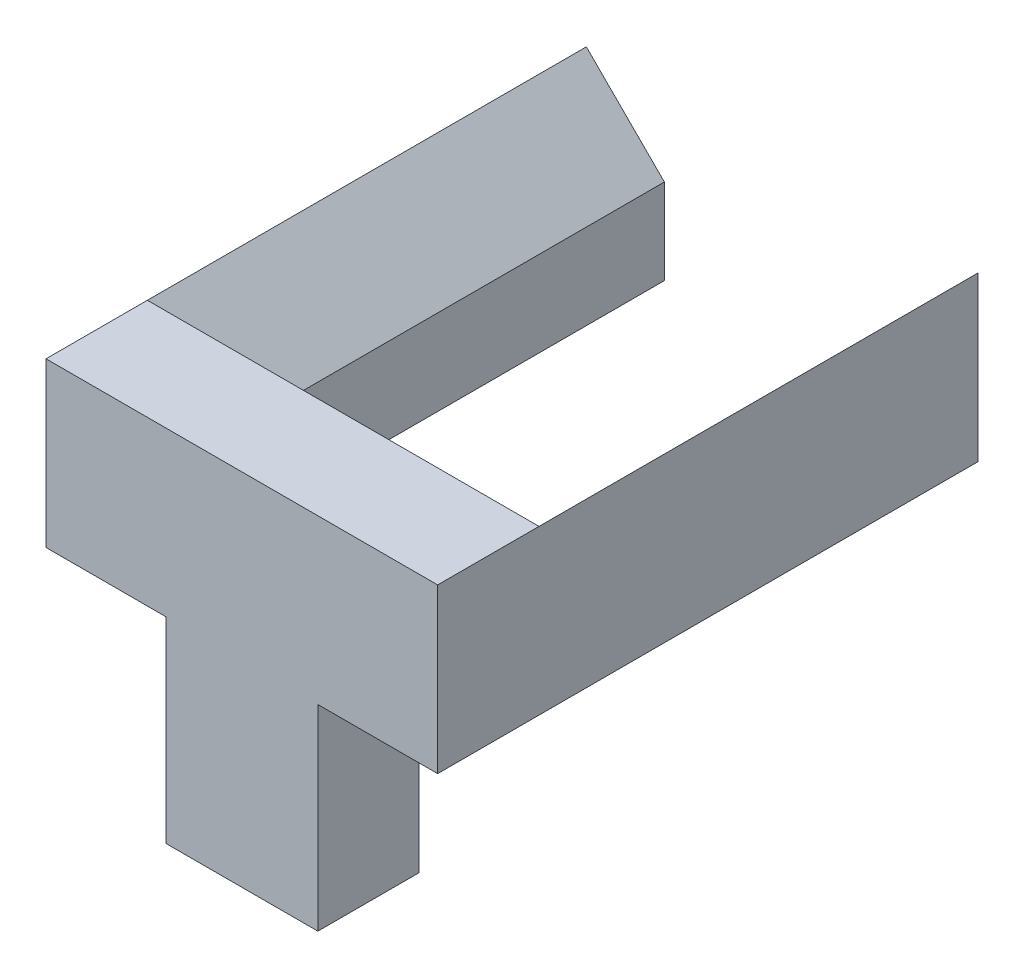
ISO-10303-21;
HEADER;
FILE_DESCRIPTION(('STEP AP214'),'2;1');
FILE_NAME('part.step','',(''),(''),'','','');
FILE_SCHEMA(('AUTOMOTIVE_DESIGN { 1 0 10303 214 1 1 1 1 }'));
ENDSEC;
DATA;
#1=APPLICATION_CONTEXT('core data for automotive mechanical design processes');
#2=APPLICATION_PROTOCOL_DEFINITION('international standard','automotive_design',2000,#1);
#3=PRODUCT_CONTEXT('',#1,'mechanical');
#4=PRODUCT('Part','Part','',(#3));
#5=PRODUCT_RELATED_PRODUCT_CATEGORY('part','',(#4));
#6=PRODUCT_DEFINITION_FORMATION('','',#4);
#7=PRODUCT_DEFINITION_CONTEXT('part definition',#1,'design');
#8=PRODUCT_DEFINITION('design','',#6,#7);
#9=PRODUCT_DEFINITION_SHAPE('','',#8);
#10=(LENGTH_UNIT() NAMED_UNIT(*) SI_UNIT(.MILLI.,.METRE.));
#11=(NAMED_UNIT(*) PLANE_ANGLE_UNIT() SI_UNIT($,.RADIAN.));
#12=(NAMED_UNIT(*) SI_UNIT($,.STERADIAN.) SOLID_ANGLE_UNIT());
#13=UNCERTAINTY_MEASURE_WITH_UNIT(LENGTH_MEASURE(1.E-05),#10,'distance_accuracy_value','');
#14=(GEOMETRIC_REPRESENTATION_CONTEXT(3) GLOBAL_UNCERTAINTY_ASSIGNED_CONTEXT((#13)) GLOBAL_UNIT_ASSIGNED_CONTEXT((#10,
#11,#12)) REPRESENTATION_CONTEXT('',''));
#15=CARTESIAN_POINT('',(0.,0.,0.));
#16=DIRECTION('',(0.,0.,1.));
#17=DIRECTION('',(1.,0.,0.));
#18=AXIS2_PLACEMENT_3D('',#15,#16,#17);
#19=CARTESIAN_POINT('',(24.111883246052,90.1598,-12.8424860958876));
#20=DIRECTION('',(0.,0.,1.));
#21=DIRECTION('',(1.,0.,0.));
#22=AXIS2_PLACEMENT_3D('',#19,#20,#21);
#23=PLANE('',#22);
#24=DIRECTION('',(0.707106781186541,-0.707106781186554,0.));
#25=VECTOR('',#24,1.);
#26=CARTESIAN_POINT('',(-44.010916753948,90.1598,-12.8424860958876));
#27=LINE('',#26,#25);
#28=CARTESIAN_POINT('',(-44.010916753948,90.1598,-12.8424860958876));
#29=VERTEX_POINT('',#28);
#30=CARTESIAN_POINT('',(-24.452916753948,70.6017999999997,-12.8424860958876));
#31=VERTEX_POINT('',#30);
#32=EDGE_CURVE('E166',#29,#31,#27,.T.);
#33=ORIENTED_EDGE('',*,*,#32,.F.);
#34=DIRECTION('',(-1.,0.,0.));
#35=VECTOR('',#34,1.);
#36=CARTESIAN_POINT('',(24.111883246052,90.1598,-12.8424860958876));
#37=LINE('',#36,#35);
#38=CARTESIAN_POINT('',(54.134683246052,90.1598,-12.8424860958876));
#39=VERTEX_POINT('',#38);
#40=EDGE_CURVE('E250',#39,#29,#37,.T.);
#41=ORIENTED_EDGE('',*,*,#40,.F.);
#42=DIRECTION('',(0.707106781186556,0.707106781186539,0.));
#43=VECTOR('',#42,1.);
#44=CARTESIAN_POINT('',(54.134683246052,90.1598,-12.8424860958876));
#45=LINE('',#44,#43);
#46=CARTESIAN_POINT('',(34.576683246052,70.6018000000005,-12.8424860958876));
#47=VERTEX_POINT('',#46);
#48=EDGE_CURVE('E169',#47,#39,#45,.T.);
#49=ORIENTED_EDGE('',*,*,#48,.F.);
#50=DIRECTION('',(0.,1.,0.));
#51=VECTOR('',#50,1.);
#52=CARTESIAN_POINT('',(34.576683246052,70.6018000000005,-12.8424860958876));
#53=LINE('',#52,#51);
#54=CARTESIAN_POINT('',(34.576683246052,49.1998,-12.8424860958876));
#55=VERTEX_POINT('',#54);
#56=EDGE_CURVE('E61',#55,#47,#53,.T.);
#57=ORIENTED_EDGE('',*,*,#56,.F.);
#58=DIRECTION('',(-1.,0.,0.));
#59=VECTOR('',#58,1.);
#60=CARTESIAN_POINT('',(54.134683246052,49.1998,-12.8424860958876));
#61=LINE('',#60,#59);
#62=CARTESIAN_POINT('',(24.111883246052,49.1998,-12.8424860958876));
#63=VERTEX_POINT('',#62);
#64=EDGE_CURVE('E240',#55,#63,#61,.T.);
#65=ORIENTED_EDGE('',*,*,#64,.T.);
#66=DIRECTION('',(0.,-1.,0.));
#67=VECTOR('',#66,1.);
#68=CARTESIAN_POINT('',(24.111883246052,90.1598,-12.8424860958876));
#69=LINE('',#68,#67);
#70=CARTESIAN_POINT('',(24.111883246052,0.,-12.8424860958876));
#71=VERTEX_POINT('',#70);
#72=EDGE_CURVE('E11',#63,#71,#69,.T.);
#73=ORIENTED_EDGE('',*,*,#72,.T.);
#74=DIRECTION('',(-1.,0.,0.));
#75=VECTOR('',#74,1.);
#76=CARTESIAN_POINT('',(24.111883246052,0.,-12.8424860958876));
#77=LINE('',#76,#75);
#78=CARTESIAN_POINT('',(-13.988116753948,0.,-12.8424860958876));
#79=VERTEX_POINT('',#78);
#80=EDGE_CURVE('E262',#71,#79,#77,.T.);
#81=ORIENTED_EDGE('',*,*,#80,.T.);
#82=DIRECTION('',(0.,-1.,0.));
#83=VECTOR('',#82,1.);
#84=CARTESIAN_POINT('',(-13.988116753948,90.1598,-12.8424860958876));
#85=LINE('',#84,#83);
#86=CARTESIAN_POINT('',(-13.988116753948,49.1998,-12.8424860958876));
#87=VERTEX_POINT('',#86);
#88=EDGE_CURVE('E54',#87,#79,#85,.T.);
#89=ORIENTED_EDGE('',*,*,#88,.F.);
#90=DIRECTION('',(1.,0.,0.));
#91=VECTOR('',#90,1.);
#92=CARTESIAN_POINT('',(-44.010916753948,49.1998,-12.8424860958876));
#93=LINE('',#92,#91);
#94=CARTESIAN_POINT('',(-24.452916753948,49.1998,-12.8424860958876));
#95=VERTEX_POINT('',#94);
#96=EDGE_CURVE('E69',#95,#87,#93,.T.);
#97=ORIENTED_EDGE('',*,*,#96,.F.);
#98=DIRECTION('',(0.,-1.,0.));
#99=VECTOR('',#98,1.);
#100=CARTESIAN_POINT('',(-24.452916753948,70.6017999999997,-12.8424860958876));
#101=LINE('',#100,#99);
#102=EDGE_CURVE('E162',#31,#95,#101,.T.);
#103=ORIENTED_EDGE('',*,*,#102,.F.);
#104=EDGE_LOOP('',(#33,#41,#49,#57,#65,#73,#81,#89,#97,#103));
#105=FACE_BOUND('',#104,.T.);
#106=ADVANCED_FACE('F45',(#105),#23,.F.);
#107=CARTESIAN_POINT('',(-13.988116753948,90.1598,-12.8424860958876));
#108=DIRECTION('',(1.,0.,0.));
#109=DIRECTION('',(0.,0.,-1.));
#110=AXIS2_PLACEMENT_3D('',#107,#108,#109);
#111=PLANE('',#110);
#112=DIRECTION('',(0.,0.,1.));
#113=VECTOR('',#112,1.);
#114=CARTESIAN_POINT('',(-13.988116753948,49.1998,-12.8424860958876));
#115=LINE('',#114,#113);
#116=CARTESIAN_POINT('',(-13.988116753948,49.1998,12.5575139041124));
#117=VERTEX_POINT('',#116);
#118=EDGE_CURVE('E207',#87,#117,#115,.T.);
#119=ORIENTED_EDGE('',*,*,#118,.F.);
#120=ORIENTED_EDGE('',*,*,#88,.T.);
#121=DIRECTION('',(0.,0.,1.));
#122=VECTOR('',#121,1.);
#123=CARTESIAN_POINT('',(-13.988116753948,0.,-12.8424860958876));
#124=LINE('',#123,#122);
#125=CARTESIAN_POINT('',(-13.988116753948,0.,12.5575139041124));
#126=VERTEX_POINT('',#125);
#127=EDGE_CURVE('E266',#79,#126,#124,.T.);
#128=ORIENTED_EDGE('',*,*,#127,.T.);
#129=DIRECTION('',(0.,-1.,0.));
#130=VECTOR('',#129,1.);
#131=CARTESIAN_POINT('',(-13.988116753948,90.1598,12.5575139041124));
#132=LINE('',#131,#130);
#133=EDGE_CURVE('E275',#117,#126,#132,.T.);
#134=ORIENTED_EDGE('',*,*,#133,.F.);
#135=EDGE_LOOP('',(#119,#120,#128,#134));
#136=FACE_BOUND('',#135,.T.);
#137=ADVANCED_FACE('F280',(#136),#111,.F.);
#138=CARTESIAN_POINT('',(24.111883246052,90.1598,12.5575139041124));
#139=DIRECTION('',(-1.,0.,0.));
#140=DIRECTION('',(0.,0.,1.));
#141=AXIS2_PLACEMENT_3D('',#138,#139,#140);
#142=PLANE('',#141);
#143=ORIENTED_EDGE('',*,*,#72,.F.);
#144=DIRECTION('',(0.,0.,1.));
#145=VECTOR('',#144,1.);
#146=CARTESIAN_POINT('',(24.111883246052,49.1998,-12.8424860958876));
#147=LINE('',#146,#145);
#148=CARTESIAN_POINT('',(24.111883246052,49.1998,12.5575139041124));
#149=VERTEX_POINT('',#148);
#150=EDGE_CURVE('E227',#63,#149,#147,.T.);
#151=ORIENTED_EDGE('',*,*,#150,.T.);
#152=DIRECTION('',(0.,-1.,0.));
#153=VECTOR('',#152,1.);
#154=CARTESIAN_POINT('',(24.111883246052,90.1598,12.5575139041124));
#155=LINE('',#154,#153);
#156=CARTESIAN_POINT('',(24.111883246052,0.,12.5575139041124));
#157=VERTEX_POINT('',#156);
#158=EDGE_CURVE('E258',#149,#157,#155,.T.);
#159=ORIENTED_EDGE('',*,*,#158,.T.);
#160=DIRECTION('',(0.,0.,-1.));
#161=VECTOR('',#160,1.);
#162=CARTESIAN_POINT('',(24.111883246052,0.,12.5575139041124));
#163=LINE('',#162,#161);
#164=EDGE_CURVE('E247',#157,#71,#163,.T.);
#165=ORIENTED_EDGE('',*,*,#164,.T.);
#166=EDGE_LOOP('',(#143,#151,#159,#165));
#167=FACE_BOUND('',#166,.T.);
#168=ADVANCED_FACE('F47',(#167),#142,.F.);
#169=CARTESIAN_POINT('',(-13.988116753948,90.1598,12.5575139041124));
#170=DIRECTION('',(0.,0.,-1.));
#171=DIRECTION('',(-1.,0.,0.));
#172=AXIS2_PLACEMENT_3D('',#169,#170,#171);
#173=PLANE('',#172);
#174=DIRECTION('',(1.,0.,0.));
#175=VECTOR('',#174,1.);
#176=CARTESIAN_POINT('',(-13.988116753948,0.,12.5575139041124));
#177=LINE('',#176,#175);
#178=EDGE_CURVE('E255',#126,#157,#177,.T.);
#179=ORIENTED_EDGE('',*,*,#178,.T.);
#180=ORIENTED_EDGE('',*,*,#158,.F.);
#181=DIRECTION('',(-1.,0.,0.));
#182=VECTOR('',#181,1.);
#183=CARTESIAN_POINT('',(54.134683246052,49.1998,12.5575139041124));
#184=LINE('',#183,#182);
#185=CARTESIAN_POINT('',(54.134683246052,49.1998,12.5575139041124));
#186=VERTEX_POINT('',#185);
#187=EDGE_CURVE('E244',#186,#149,#184,.T.);
#188=ORIENTED_EDGE('',*,*,#187,.F.);
#189=DIRECTION('',(0.,1.,0.));
#190=VECTOR('',#189,1.);
#191=CARTESIAN_POINT('',(54.134683246052,49.1998,12.5575139041124));
#192=LINE('',#191,#190);
#193=CARTESIAN_POINT('',(54.134683246052,90.1598,12.5575139041124));
#194=VERTEX_POINT('',#193);
#195=EDGE_CURVE('E236',#186,#194,#192,.T.);
#196=ORIENTED_EDGE('',*,*,#195,.T.);
#197=DIRECTION('',(1.,0.,0.));
#198=VECTOR('',#197,1.);
#199=CARTESIAN_POINT('',(-13.988116753948,90.1598,12.5575139041124));
#200=LINE('',#199,#198);
#201=CARTESIAN_POINT('',(-44.010916753948,90.1598,12.5575139041124));
#202=VERTEX_POINT('',#201);
#203=EDGE_CURVE('E254',#202,#194,#200,.T.);
#204=ORIENTED_EDGE('',*,*,#203,.F.);
#205=DIRECTION('',(0.,1.,0.));
#206=VECTOR('',#205,1.);
#207=CARTESIAN_POINT('',(-44.010916753948,90.1598,12.5575139041124));
#208=LINE('',#207,#206);
#209=CARTESIAN_POINT('',(-44.010916753948,49.1998,12.5575139041124));
#210=VERTEX_POINT('',#209);
#211=EDGE_CURVE('E211',#210,#202,#208,.T.);
#212=ORIENTED_EDGE('',*,*,#211,.F.);
#213=DIRECTION('',(1.,0.,0.));
#214=VECTOR('',#213,1.);
#215=CARTESIAN_POINT('',(-44.010916753948,49.1998,12.5575139041124));
#216=LINE('',#215,#214);
#217=EDGE_CURVE('E219',#210,#117,#216,.T.);
#218=ORIENTED_EDGE('',*,*,#217,.T.);
#219=ORIENTED_EDGE('',*,*,#133,.T.);
#220=EDGE_LOOP('',(#179,#180,#188,#196,#204,#212,#218,#219));
#221=FACE_BOUND('',#220,.T.);
#222=ADVANCED_FACE('F290',(#221),#173,.F.);
#223=CARTESIAN_POINT('',(0.,90.1598,0.));
#224=DIRECTION('',(0.,1.,0.));
#225=DIRECTION('',(0.,0.,1.));
#226=AXIS2_PLACEMENT_3D('',#223,#224,#225);
#227=PLANE('',#226);
#228=ORIENTED_EDGE('',*,*,#203,.T.);
#229=DIRECTION('',(0.,0.,-1.));
#230=VECTOR('',#229,1.);
#231=CARTESIAN_POINT('',(54.134683246052,90.1598,12.5575139041124));
#232=LINE('',#231,#230);
#233=EDGE_CURVE('E228',#194,#39,#232,.T.);
#234=ORIENTED_EDGE('',*,*,#233,.T.);
#235=ORIENTED_EDGE('',*,*,#40,.T.);
#236=DIRECTION('',(0.,0.,-1.));
#237=VECTOR('',#236,1.);
#238=CARTESIAN_POINT('',(-44.010916753948,90.1598,-12.8424860958876));
#239=LINE('',#238,#237);
#240=EDGE_CURVE('E215',#202,#29,#239,.T.);
#241=ORIENTED_EDGE('',*,*,#240,.F.);
#242=EDGE_LOOP('',(#228,#234,#235,#241));
#243=FACE_BOUND('',#242,.T.);
#244=ADVANCED_FACE('F298',(#243),#227,.T.);
#245=CARTESIAN_POINT('',(0.,0.,0.));
#246=DIRECTION('',(0.,1.,0.));
#247=DIRECTION('',(0.,0.,1.));
#248=AXIS2_PLACEMENT_3D('',#245,#246,#247);
#249=PLANE('',#248);
#250=CARTESIAN_POINT('',(-4.93811675394796,0.,-0.142486095887624));
#251=DIRECTION('',(0.,-1.,0.));
#252=DIRECTION('',(0.,0.,-1.));
#253=AXIS2_PLACEMENT_3D('',#250,#251,#252);
#254=CIRCLE('',#253,3.81);
#255=CARTESIAN_POINT('',(-4.93811675394796,0.,-3.95248609588762));
#256=VERTEX_POINT('',#255);
#257=EDGE_CURVE('E307',#256,#256,#254,.T.);
#258=ORIENTED_EDGE('',*,*,#257,.F.);
#259=EDGE_LOOP('',(#258));
#260=FACE_BOUND('',#259,.T.);
#261=CARTESIAN_POINT('',(15.061883246052,0.,-0.142486095887622));
#262=DIRECTION('',(0.,-1.,0.));
#263=DIRECTION('',(0.,0.,-1.));
#264=AXIS2_PLACEMENT_3D('',#261,#262,#263);
#265=CIRCLE('',#264,3.81);
#266=CARTESIAN_POINT('',(15.061883246052,0.,-3.95248609588762));
#267=VERTEX_POINT('',#266);
#268=EDGE_CURVE('E319',#267,#267,#265,.T.);
#269=ORIENTED_EDGE('',*,*,#268,.F.);
#270=EDGE_LOOP('',(#269));
#271=FACE_BOUND('',#270,.T.);
#272=ORIENTED_EDGE('',*,*,#164,.F.);
#273=ORIENTED_EDGE('',*,*,#178,.F.);
#274=ORIENTED_EDGE('',*,*,#127,.F.);
#275=ORIENTED_EDGE('',*,*,#80,.F.);
#276=EDGE_LOOP('',(#272,#273,#274,#275));
#277=FACE_BOUND('',#276,.T.);
#278=ADVANCED_FACE('F287',(#260,#271,#277),#249,.F.);
#279=CARTESIAN_POINT('',(54.134683246052,49.1998,-12.8424860958876));
#280=DIRECTION('',(0.,-1.,0.));
#281=DIRECTION('',(0.,0.,-1.));
#282=AXIS2_PLACEMENT_3D('',#279,#280,#281);
#283=PLANE('',#282);
#284=ORIENTED_EDGE('',*,*,#150,.F.);
#285=ORIENTED_EDGE('',*,*,#64,.F.);
#286=DIRECTION('',(0.,0.,1.));
#287=VECTOR('',#286,1.);
#288=CARTESIAN_POINT('',(34.576683246052,49.1998,-122.849886095888));
#289=LINE('',#288,#287);
#290=CARTESIAN_POINT('',(34.576683246052,49.1998,-122.849886095888));
#291=VERTEX_POINT('',#290);
#292=EDGE_CURVE('E199',#291,#55,#289,.T.);
#293=ORIENTED_EDGE('',*,*,#292,.F.);
#294=DIRECTION('',(-1.,0.,0.));
#295=VECTOR('',#294,1.);
#296=CARTESIAN_POINT('',(34.576683246052,49.1998,-122.849886095888));
#297=LINE('',#296,#295);
#298=CARTESIAN_POINT('',(54.134683246052,49.1998,-122.849886095888));
#299=VERTEX_POINT('',#298);
#300=EDGE_CURVE('E187',#299,#291,#297,.T.);
#301=ORIENTED_EDGE('',*,*,#300,.F.);
#302=DIRECTION('',(0.,0.,1.));
#303=VECTOR('',#302,1.);
#304=CARTESIAN_POINT('',(54.134683246052,49.1998,-12.8424860958876));
#305=LINE('',#304,#303);
#306=EDGE_CURVE('E232',#299,#186,#305,.T.);
#307=ORIENTED_EDGE('',*,*,#306,.T.);
#308=ORIENTED_EDGE('',*,*,#187,.T.);
#309=EDGE_LOOP('',(#284,#285,#293,#301,#307,#308));
#310=FACE_BOUND('',#309,.T.);
#311=ADVANCED_FACE('F331',(#310),#283,.T.);
#312=CARTESIAN_POINT('',(54.134683246052,0.,0.));
#313=DIRECTION('',(-1.,0.,0.));
#314=DIRECTION('',(0.,0.,1.));
#315=AXIS2_PLACEMENT_3D('',#312,#313,#314);
#316=PLANE('',#315);
#317=ORIENTED_EDGE('',*,*,#233,.F.);
#318=ORIENTED_EDGE('',*,*,#195,.F.);
#319=ORIENTED_EDGE('',*,*,#306,.F.);
#320=DIRECTION('',(0.,-1.,0.));
#321=VECTOR('',#320,1.);
#322=CARTESIAN_POINT('',(54.134683246052,90.1598,-122.849886095888));
#323=LINE('',#322,#321);
#324=CARTESIAN_POINT('',(54.134683246052,90.1598,-122.849886095888));
#325=VERTEX_POINT('',#324);
#326=EDGE_CURVE('E183',#325,#299,#323,.T.);
#327=ORIENTED_EDGE('',*,*,#326,.F.);
#328=DIRECTION('',(0.,0.,1.));
#329=VECTOR('',#328,1.);
#330=CARTESIAN_POINT('',(54.134683246052,90.1598,-122.849886095888));
#331=LINE('',#330,#329);
#332=EDGE_CURVE('E203',#325,#39,#331,.T.);
#333=ORIENTED_EDGE('',*,*,#332,.T.);
#334=EDGE_LOOP('',(#317,#318,#319,#327,#333));
#335=FACE_BOUND('',#334,.T.);
#336=ADVANCED_FACE('F362',(#335),#316,.F.);
#337=CARTESIAN_POINT('',(-44.010916753948,49.1998,-12.8424860958876));
#338=DIRECTION('',(0.,1.,0.));
#339=DIRECTION('',(0.,0.,1.));
#340=AXIS2_PLACEMENT_3D('',#337,#338,#339);
#341=PLANE('',#340);
#342=ORIENTED_EDGE('',*,*,#118,.T.);
#343=ORIENTED_EDGE('',*,*,#217,.F.);
#344=DIRECTION('',(0.,0.,1.));
#345=VECTOR('',#344,1.);
#346=CARTESIAN_POINT('',(-44.010916753948,49.1998,-12.8424860958876));
#347=LINE('',#346,#345);
#348=CARTESIAN_POINT('',(-44.010916753948,49.1998,-122.849886095888));
#349=VERTEX_POINT('',#348);
#350=EDGE_CURVE('E208',#349,#210,#347,.T.);
#351=ORIENTED_EDGE('',*,*,#350,.F.);
#352=DIRECTION('',(1.,0.,0.));
#353=VECTOR('',#352,1.);
#354=CARTESIAN_POINT('',(-44.010916753948,49.1998,-122.849886095888));
#355=LINE('',#354,#353);
#356=CARTESIAN_POINT('',(-24.452916753948,49.1998,-122.849886095888));
#357=VERTEX_POINT('',#356);
#358=EDGE_CURVE('E152',#349,#357,#355,.T.);
#359=ORIENTED_EDGE('',*,*,#358,.T.);
#360=DIRECTION('',(0.,0.,1.));
#361=VECTOR('',#360,1.);
#362=CARTESIAN_POINT('',(-24.452916753948,49.1998,-122.849886095888));
#363=LINE('',#362,#361);
#364=EDGE_CURVE('E147',#357,#95,#363,.T.);
#365=ORIENTED_EDGE('',*,*,#364,.T.);
#366=ORIENTED_EDGE('',*,*,#96,.T.);
#367=EDGE_LOOP('',(#342,#343,#351,#359,#365,#366));
#368=FACE_BOUND('',#367,.T.);
#369=ADVANCED_FACE('F293',(#368),#341,.F.);
#370=CARTESIAN_POINT('',(-44.010916753948,0.,0.));
#371=DIRECTION('',(-1.,0.,0.));
#372=DIRECTION('',(0.,0.,1.));
#373=AXIS2_PLACEMENT_3D('',#370,#371,#372);
#374=PLANE('',#373);
#375=ORIENTED_EDGE('',*,*,#240,.T.);
#376=DIRECTION('',(0.,0.,1.));
#377=VECTOR('',#376,1.);
#378=CARTESIAN_POINT('',(-44.010916753948,90.1598,-122.849886095888));
#379=LINE('',#378,#377);
#380=CARTESIAN_POINT('',(-44.010916753948,90.1598,-122.849886095888));
#381=VERTEX_POINT('',#380);
#382=EDGE_CURVE('E175',#381,#29,#379,.T.);
#383=ORIENTED_EDGE('',*,*,#382,.F.);
#384=DIRECTION('',(0.,-1.,0.));
#385=VECTOR('',#384,1.);
#386=CARTESIAN_POINT('',(-44.010916753948,90.1598,-122.849886095888));
#387=LINE('',#386,#385);
#388=EDGE_CURVE('E159',#381,#349,#387,.T.);
#389=ORIENTED_EDGE('',*,*,#388,.T.);
#390=ORIENTED_EDGE('',*,*,#350,.T.);
#391=ORIENTED_EDGE('',*,*,#211,.T.);
#392=EDGE_LOOP('',(#375,#383,#389,#390,#391));
#393=FACE_BOUND('',#392,.T.);
#394=ADVANCED_FACE('F296',(#393),#374,.T.);
#395=CARTESIAN_POINT('',(54.134683246052,90.1598,-122.849886095888));
#396=DIRECTION('',(0.707106781186539,-0.707106781186556,0.));
#397=DIRECTION('',(0.707106781186556,0.707106781186539,0.));
#398=AXIS2_PLACEMENT_3D('',#395,#396,#397);
#399=PLANE('',#398);
#400=ORIENTED_EDGE('',*,*,#48,.T.);
#401=ORIENTED_EDGE('',*,*,#332,.F.);
#402=DIRECTION('',(0.707106781186556,0.707106781186539,0.));
#403=VECTOR('',#402,1.);
#404=CARTESIAN_POINT('',(54.134683246052,90.1598,-122.849886095888));
#405=LINE('',#404,#403);
#406=CARTESIAN_POINT('',(34.576683246052,70.6018000000005,-122.849886095888));
#407=VERTEX_POINT('',#406);
#408=EDGE_CURVE('E179',#407,#325,#405,.T.);
#409=ORIENTED_EDGE('',*,*,#408,.F.);
#410=DIRECTION('',(0.,0.,1.));
#411=VECTOR('',#410,1.);
#412=CARTESIAN_POINT('',(34.576683246052,70.6018000000005,-122.849886095888));
#413=LINE('',#412,#411);
#414=EDGE_CURVE('E192',#407,#47,#413,.T.);
#415=ORIENTED_EDGE('',*,*,#414,.T.);
#416=EDGE_LOOP('',(#400,#401,#409,#415));
#417=FACE_BOUND('',#416,.T.);
#418=ADVANCED_FACE('F371',(#417),#399,.F.);
#419=CARTESIAN_POINT('',(34.576683246052,70.6018000000005,-122.849886095888));
#420=DIRECTION('',(1.,0.,0.));
#421=DIRECTION('',(0.,0.,-1.));
#422=AXIS2_PLACEMENT_3D('',#419,#420,#421);
#423=PLANE('',#422);
#424=ORIENTED_EDGE('',*,*,#56,.T.);
#425=ORIENTED_EDGE('',*,*,#414,.F.);
#426=DIRECTION('',(0.,1.,0.));
#427=VECTOR('',#426,1.);
#428=CARTESIAN_POINT('',(34.576683246052,70.6018000000005,-122.849886095888));
#429=LINE('',#428,#427);
#430=EDGE_CURVE('E190',#291,#407,#429,.T.);
#431=ORIENTED_EDGE('',*,*,#430,.F.);
#432=ORIENTED_EDGE('',*,*,#292,.T.);
#433=EDGE_LOOP('',(#424,#425,#431,#432));
#434=FACE_BOUND('',#433,.T.);
#435=ADVANCED_FACE('F374',(#434),#423,.F.);
#436=CARTESIAN_POINT('',(0.,0.,-122.849886095888));
#437=DIRECTION('',(0.,0.,1.));
#438=DIRECTION('',(1.,0.,0.));
#439=AXIS2_PLACEMENT_3D('',#436,#437,#438);
#440=PLANE('',#439);
#441=ORIENTED_EDGE('',*,*,#408,.T.);
#442=ORIENTED_EDGE('',*,*,#326,.T.);
#443=ORIENTED_EDGE('',*,*,#300,.T.);
#444=ORIENTED_EDGE('',*,*,#430,.T.);
#445=EDGE_LOOP('',(#441,#442,#443,#444));
#446=FACE_BOUND('',#445,.T.);
#447=ADVANCED_FACE('F378',(#446),#440,.F.);
#448=CARTESIAN_POINT('',(-44.010916753948,90.1598,-122.849886095888));
#449=DIRECTION('',(-0.707106781186554,-0.707106781186541,0.));
#450=DIRECTION('',(0.707106781186541,-0.707106781186554,0.));
#451=AXIS2_PLACEMENT_3D('',#448,#449,#450);
#452=PLANE('',#451);
#453=ORIENTED_EDGE('',*,*,#32,.T.);
#454=DIRECTION('',(0.,0.,1.));
#455=VECTOR('',#454,1.);
#456=CARTESIAN_POINT('',(-24.452916753948,70.6017999999997,-122.849886095888));
#457=LINE('',#456,#455);
#458=CARTESIAN_POINT('',(-24.452916753948,70.6017999999997,-122.849886095888));
#459=VERTEX_POINT('',#458);
#460=EDGE_CURVE('E145',#459,#31,#457,.T.);
#461=ORIENTED_EDGE('',*,*,#460,.F.);
#462=DIRECTION('',(0.707106781186541,-0.707106781186554,0.));
#463=VECTOR('',#462,1.);
#464=CARTESIAN_POINT('',(-44.010916753948,90.1598,-122.849886095888));
#465=LINE('',#464,#463);
#466=EDGE_CURVE('E153',#381,#459,#465,.T.);
#467=ORIENTED_EDGE('',*,*,#466,.F.);
#468=ORIENTED_EDGE('',*,*,#382,.T.);
#469=EDGE_LOOP('',(#453,#461,#467,#468));
#470=FACE_BOUND('',#469,.T.);
#471=ADVANCED_FACE('F164',(#470),#452,.F.);
#472=CARTESIAN_POINT('',(-24.452916753948,70.6017999999997,-122.849886095888));
#473=DIRECTION('',(-1.,0.,0.));
#474=DIRECTION('',(0.,0.,1.));
#475=AXIS2_PLACEMENT_3D('',#472,#473,#474);
#476=PLANE('',#475);
#477=ORIENTED_EDGE('',*,*,#102,.T.);
#478=ORIENTED_EDGE('',*,*,#364,.F.);
#479=DIRECTION('',(0.,-1.,0.));
#480=VECTOR('',#479,1.);
#481=CARTESIAN_POINT('',(-24.452916753948,70.6017999999997,-122.849886095888));
#482=LINE('',#481,#480);
#483=EDGE_CURVE('E140',#459,#357,#482,.T.);
#484=ORIENTED_EDGE('',*,*,#483,.F.);
#485=ORIENTED_EDGE('',*,*,#460,.T.);
#486=EDGE_LOOP('',(#477,#478,#484,#485));
#487=FACE_BOUND('',#486,.T.);
#488=ADVANCED_FACE('F143',(#487),#476,.F.);
#489=CARTESIAN_POINT('',(0.,0.,-122.849886095888));
#490=DIRECTION('',(0.,0.,-1.));
#491=DIRECTION('',(-1.,0.,0.));
#492=AXIS2_PLACEMENT_3D('',#489,#490,#491);
#493=PLANE('',#492);
#494=ORIENTED_EDGE('',*,*,#466,.T.);
#495=ORIENTED_EDGE('',*,*,#483,.T.);
#496=ORIENTED_EDGE('',*,*,#358,.F.);
#497=ORIENTED_EDGE('',*,*,#388,.F.);
#498=EDGE_LOOP('',(#494,#495,#496,#497));
#499=FACE_BOUND('',#498,.T.);
#500=ADVANCED_FACE('F157',(#499),#493,.T.);
#501=CARTESIAN_POINT('',(15.061883246052,25.4,-0.142486095887622));
#502=DIRECTION('',(0.,-1.,0.));
#503=DIRECTION('',(0.,0.,-1.));
#504=AXIS2_PLACEMENT_3D('',#501,#502,#503);
#505=CYLINDRICAL_SURFACE('',#504,3.81);
#506=CARTESIAN_POINT('',(15.061883246052,25.4,-0.142486095887622));
#507=DIRECTION('',(0.,-1.,0.));
#508=DIRECTION('',(0.,0.,-1.));
#509=AXIS2_PLACEMENT_3D('',#506,#507,#508);
#510=CIRCLE('',#509,3.81);
#511=CARTESIAN_POINT('',(15.061883246052,25.4,-3.95248609588762));
#512=VERTEX_POINT('',#511);
#513=EDGE_CURVE('E315',#512,#512,#510,.T.);
#514=ORIENTED_EDGE('',*,*,#513,.F.);
#515=EDGE_LOOP('',(#514));
#516=FACE_BOUND('',#515,.T.);
#517=ORIENTED_EDGE('',*,*,#268,.T.);
#518=EDGE_LOOP('',(#517));
#519=FACE_BOUND('',#518,.T.);
#520=ADVANCED_FACE('F335',(#516,#519),#505,.F.);
#521=CARTESIAN_POINT('',(15.061883246052,25.4,-0.142486095887622));
#522=DIRECTION('',(0.,-1.,0.));
#523=DIRECTION('',(0.,0.,-1.));
#524=AXIS2_PLACEMENT_3D('',#521,#522,#523);
#525=PLANE('',#524);
#526=ORIENTED_EDGE('',*,*,#513,.T.);
#527=EDGE_LOOP('',(#526));
#528=FACE_BOUND('',#527,.T.);
#529=ADVANCED_FACE('F337',(#528),#525,.T.);
#530=CARTESIAN_POINT('',(-4.93811675394796,25.4,-0.142486095887624));
#531=DIRECTION('',(0.,-1.,0.));
#532=DIRECTION('',(0.,0.,-1.));
#533=AXIS2_PLACEMENT_3D('',#530,#531,#532);
#534=CYLINDRICAL_SURFACE('',#533,3.81);
#535=CARTESIAN_POINT('',(-4.93811675394796,25.4,-0.142486095887624));
#536=DIRECTION('',(0.,-1.,0.));
#537=DIRECTION('',(0.,0.,-1.));
#538=AXIS2_PLACEMENT_3D('',#535,#536,#537);
#539=CIRCLE('',#538,3.81);
#540=CARTESIAN_POINT('',(-4.93811675394796,25.4,-3.95248609588762));
#541=VERTEX_POINT('',#540);
#542=EDGE_CURVE('E301',#541,#541,#539,.T.);
#543=ORIENTED_EDGE('',*,*,#542,.F.);
#544=EDGE_LOOP('',(#543));
#545=FACE_BOUND('',#544,.T.);
#546=ORIENTED_EDGE('',*,*,#257,.T.);
#547=EDGE_LOOP('',(#546));
#548=FACE_BOUND('',#547,.T.);
#549=ADVANCED_FACE('F327',(#545,#548),#534,.F.);
#550=CARTESIAN_POINT('',(-4.93811675394796,25.4,-0.142486095887624));
#551=DIRECTION('',(0.,-1.,0.));
#552=DIRECTION('',(0.,0.,-1.));
#553=AXIS2_PLACEMENT_3D('',#550,#551,#552);
#554=PLANE('',#553);
#555=ORIENTED_EDGE('',*,*,#542,.T.);
#556=EDGE_LOOP('',(#555));
#557=FACE_BOUND('',#556,.T.);
#558=ADVANCED_FACE('F500',(#557),#554,.T.);
#559=CLOSED_SHELL('',(#106,#137,#168,#222,#244,#278,#311,#336,#369,#394,#418,#435,#447,#471,
#488,#500,#520,#529,#549,#558));
#560=MANIFOLD_SOLID_BREP('B2',#559);
#561=ADVANCED_BREP_SHAPE_REPRESENTATION('',(#18,#560),#14);
#562=SHAPE_DEFINITION_REPRESENTATION(#9,#561);
ENDSEC;
END-ISO-10303-21;
